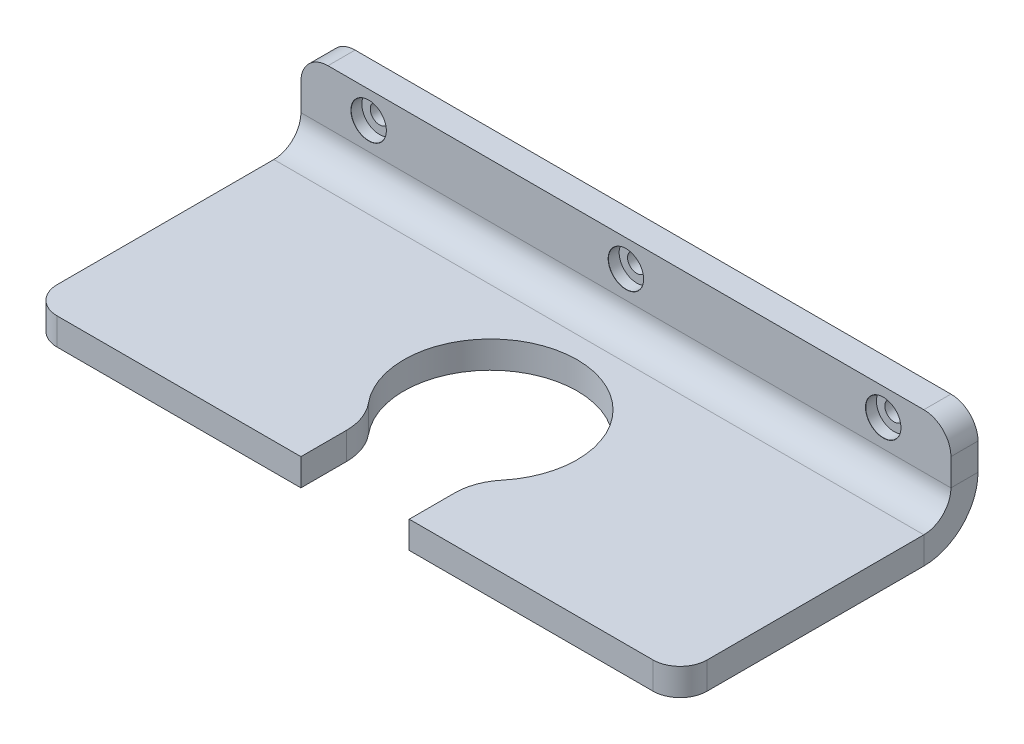
ISO-10303-21;
HEADER;
FILE_DESCRIPTION(('STEP AP214'),'2;1');
FILE_NAME('part.step','',(''),(''),'','','');
FILE_SCHEMA(('AUTOMOTIVE_DESIGN { 1 0 10303 214 1 1 1 1 }'));
ENDSEC;
DATA;
#1=APPLICATION_CONTEXT('core data for automotive mechanical design processes');
#2=APPLICATION_PROTOCOL_DEFINITION('international standard','automotive_design',2000,#1);
#3=PRODUCT_CONTEXT('',#1,'mechanical');
#4=PRODUCT('Part','Part','',(#3));
#5=PRODUCT_RELATED_PRODUCT_CATEGORY('part','',(#4));
#6=PRODUCT_DEFINITION_FORMATION('','',#4);
#7=PRODUCT_DEFINITION_CONTEXT('part definition',#1,'design');
#8=PRODUCT_DEFINITION('design','',#6,#7);
#9=PRODUCT_DEFINITION_SHAPE('','',#8);
#10=(LENGTH_UNIT() NAMED_UNIT(*) SI_UNIT(.MILLI.,.METRE.));
#11=(NAMED_UNIT(*) PLANE_ANGLE_UNIT() SI_UNIT($,.RADIAN.));
#12=(NAMED_UNIT(*) SI_UNIT($,.STERADIAN.) SOLID_ANGLE_UNIT());
#13=UNCERTAINTY_MEASURE_WITH_UNIT(LENGTH_MEASURE(1.E-05),#10,'distance_accuracy_value','');
#14=(GEOMETRIC_REPRESENTATION_CONTEXT(3) GLOBAL_UNCERTAINTY_ASSIGNED_CONTEXT((#13)) GLOBAL_UNIT_ASSIGNED_CONTEXT((#10,
#11,#12)) REPRESENTATION_CONTEXT('',''));
#15=CARTESIAN_POINT('',(0.,0.,0.));
#16=DIRECTION('',(0.,0.,1.));
#17=DIRECTION('',(1.,0.,0.));
#18=AXIS2_PLACEMENT_3D('',#15,#16,#17);
#19=CARTESIAN_POINT('',(-60.,5.,25.));
#20=DIRECTION('',(0.,0.,-1.));
#21=DIRECTION('',(-1.,0.,0.));
#22=AXIS2_PLACEMENT_3D('',#19,#20,#21);
#23=PLANE('',#22);
#24=DIRECTION('',(1.,0.,0.));
#25=VECTOR('',#24,1.);
#26=CARTESIAN_POINT('',(-60.,5.,25.));
#27=LINE('',#26,#25);
#28=CARTESIAN_POINT('',(-55.,5.,25.));
#29=VERTEX_POINT('',#28);
#30=CARTESIAN_POINT('',(-10.,5.,25.));
#31=VERTEX_POINT('',#30);
#32=EDGE_CURVE('E338',#29,#31,#27,.T.);
#33=ORIENTED_EDGE('',*,*,#32,.F.);
#34=DIRECTION('',(0.,-1.,0.));
#35=VECTOR('',#34,1.);
#36=CARTESIAN_POINT('',(-55.,5.,25.));
#37=LINE('',#36,#35);
#38=CARTESIAN_POINT('',(-55.,0.,25.));
#39=VERTEX_POINT('',#38);
#40=EDGE_CURVE('E68',#29,#39,#37,.T.);
#41=ORIENTED_EDGE('',*,*,#40,.T.);
#42=DIRECTION('',(1.,0.,0.));
#43=VECTOR('',#42,1.);
#44=CARTESIAN_POINT('',(-60.,0.,25.));
#45=LINE('',#44,#43);
#46=CARTESIAN_POINT('',(-10.,0.,25.));
#47=VERTEX_POINT('',#46);
#48=EDGE_CURVE('E334',#39,#47,#45,.T.);
#49=ORIENTED_EDGE('',*,*,#48,.T.);
#50=DIRECTION('',(0.,1.,0.));
#51=VECTOR('',#50,1.);
#52=CARTESIAN_POINT('',(-10.,0.,25.));
#53=LINE('',#52,#51);
#54=EDGE_CURVE('E246',#47,#31,#53,.T.);
#55=ORIENTED_EDGE('',*,*,#54,.T.);
#56=EDGE_LOOP('',(#33,#41,#49,#55));
#57=FACE_BOUND('',#56,.T.);
#58=ADVANCED_FACE('F59',(#57),#23,.F.);
#59=CARTESIAN_POINT('',(60.,5.,25.));
#60=DIRECTION('',(-1.,0.,0.));
#61=DIRECTION('',(0.,0.,1.));
#62=AXIS2_PLACEMENT_3D('',#59,#60,#61);
#63=PLANE('',#62);
#64=DIRECTION('',(0.,0.,-1.));
#65=VECTOR('',#64,1.);
#66=CARTESIAN_POINT('',(60.,5.,25.));
#67=LINE('',#66,#65);
#68=CARTESIAN_POINT('',(60.,5.,20.));
#69=VERTEX_POINT('',#68);
#70=CARTESIAN_POINT('',(60.,4.99999999999995,-20.));
#71=VERTEX_POINT('',#70);
#72=EDGE_CURVE('E330',#69,#71,#67,.T.);
#73=ORIENTED_EDGE('',*,*,#72,.F.);
#74=DIRECTION('',(0.,-1.,0.));
#75=VECTOR('',#74,1.);
#76=CARTESIAN_POINT('',(60.,5.,20.));
#77=LINE('',#76,#75);
#78=CARTESIAN_POINT('',(60.,0.,20.));
#79=VERTEX_POINT('',#78);
#80=EDGE_CURVE('E374',#69,#79,#77,.T.);
#81=ORIENTED_EDGE('',*,*,#80,.T.);
#82=DIRECTION('',(0.,0.,-1.));
#83=VECTOR('',#82,1.);
#84=CARTESIAN_POINT('',(60.,0.,25.));
#85=LINE('',#84,#83);
#86=CARTESIAN_POINT('',(60.,0.,-20.));
#87=VERTEX_POINT('',#86);
#88=EDGE_CURVE('E326',#79,#87,#85,.T.);
#89=ORIENTED_EDGE('',*,*,#88,.T.);
#90=DIRECTION('',(0.,-1.,0.));
#91=VECTOR('',#90,1.);
#92=CARTESIAN_POINT('',(60.,4.99999999999995,-20.));
#93=LINE('',#92,#91);
#94=EDGE_CURVE('E322',#71,#87,#93,.T.);
#95=ORIENTED_EDGE('',*,*,#94,.F.);
#96=EDGE_LOOP('',(#73,#81,#89,#95));
#97=FACE_BOUND('',#96,.T.);
#98=ADVANCED_FACE('F426',(#97),#63,.F.);
#99=CARTESIAN_POINT('',(-60.,5.,25.));
#100=DIRECTION('',(1.,0.,0.));
#101=DIRECTION('',(0.,0.,-1.));
#102=AXIS2_PLACEMENT_3D('',#99,#100,#101);
#103=PLANE('',#102);
#104=DIRECTION('',(0.,0.,1.));
#105=VECTOR('',#104,1.);
#106=CARTESIAN_POINT('',(-60.,0.,25.));
#107=LINE('',#106,#105);
#108=CARTESIAN_POINT('',(-60.,0.,-20.));
#109=VERTEX_POINT('',#108);
#110=CARTESIAN_POINT('',(-60.,0.,20.));
#111=VERTEX_POINT('',#110);
#112=EDGE_CURVE('E344',#109,#111,#107,.T.);
#113=ORIENTED_EDGE('',*,*,#112,.T.);
#114=DIRECTION('',(0.,-1.,0.));
#115=VECTOR('',#114,1.);
#116=CARTESIAN_POINT('',(-60.,5.,20.));
#117=LINE('',#116,#115);
#118=CARTESIAN_POINT('',(-60.,5.,20.));
#119=VERTEX_POINT('',#118);
#120=EDGE_CURVE('E13',#111,#119,#117,.F.);
#121=ORIENTED_EDGE('',*,*,#120,.T.);
#122=DIRECTION('',(0.,0.,1.));
#123=VECTOR('',#122,1.);
#124=CARTESIAN_POINT('',(-60.,5.,25.));
#125=LINE('',#124,#123);
#126=CARTESIAN_POINT('',(-60.,4.99999999999995,-20.));
#127=VERTEX_POINT('',#126);
#128=EDGE_CURVE('E333',#127,#119,#125,.T.);
#129=ORIENTED_EDGE('',*,*,#128,.F.);
#130=DIRECTION('',(0.,-1.,0.));
#131=VECTOR('',#130,1.);
#132=CARTESIAN_POINT('',(-60.,4.99999999999995,-20.));
#133=LINE('',#132,#131);
#134=EDGE_CURVE('E307',#127,#109,#133,.T.);
#135=ORIENTED_EDGE('',*,*,#134,.T.);
#136=EDGE_LOOP('',(#113,#121,#129,#135));
#137=FACE_BOUND('',#136,.T.);
#138=ADVANCED_FACE('F439',(#137),#103,.F.);
#139=CARTESIAN_POINT('',(0.,5.,0.));
#140=DIRECTION('',(0.,-1.,0.));
#141=DIRECTION('',(0.,0.,-1.));
#142=AXIS2_PLACEMENT_3D('',#139,#140,#141);
#143=PLANE('',#142);
#144=CARTESIAN_POINT('',(10.,5.,25.));
#145=VERTEX_POINT('',#144);
#146=CARTESIAN_POINT('',(55.,5.,25.));
#147=VERTEX_POINT('',#146);
#148=EDGE_CURVE('E337',#145,#147,#27,.T.);
#149=ORIENTED_EDGE('',*,*,#148,.T.);
#150=CARTESIAN_POINT('',(55.,5.,20.));
#151=DIRECTION('',(0.,-1.,0.));
#152=DIRECTION('',(0.,0.,-1.));
#153=AXIS2_PLACEMENT_3D('',#150,#151,#152);
#154=CIRCLE('',#153,5.);
#155=EDGE_CURVE('E389',#147,#69,#154,.F.);
#156=ORIENTED_EDGE('',*,*,#155,.T.);
#157=ORIENTED_EDGE('',*,*,#72,.T.);
#158=DIRECTION('',(-1.,0.,0.));
#159=VECTOR('',#158,1.);
#160=CARTESIAN_POINT('',(-60.,4.99999999999995,-20.));
#161=LINE('',#160,#159);
#162=EDGE_CURVE('E315',#127,#71,#161,.F.);
#163=ORIENTED_EDGE('',*,*,#162,.F.);
#164=ORIENTED_EDGE('',*,*,#128,.T.);
#165=CARTESIAN_POINT('',(-55.,5.,20.));
#166=DIRECTION('',(0.,-1.,0.));
#167=DIRECTION('',(0.,0.,-1.));
#168=AXIS2_PLACEMENT_3D('',#165,#166,#167);
#169=CIRCLE('',#168,5.);
#170=EDGE_CURVE('E80',#119,#29,#169,.F.);
#171=ORIENTED_EDGE('',*,*,#170,.T.);
#172=ORIENTED_EDGE('',*,*,#32,.T.);
#173=DIRECTION('',(0.,0.,1.));
#174=VECTOR('',#173,1.);
#175=CARTESIAN_POINT('',(-10.,5.,25.));
#176=LINE('',#175,#174);
#177=CARTESIAN_POINT('',(-9.99999999999999,5.,16.6132477258362));
#178=VERTEX_POINT('',#177);
#179=EDGE_CURVE('E214',#178,#31,#176,.T.);
#180=ORIENTED_EDGE('',*,*,#179,.F.);
#181=CARTESIAN_POINT('',(-20.,5.,16.6132477258362));
#182=DIRECTION('',(0.,-1.,0.));
#183=DIRECTION('',(0.,0.,1.));
#184=AXIS2_PLACEMENT_3D('',#181,#182,#183);
#185=CIRCLE('',#184,10.);
#186=CARTESIAN_POINT('',(-12.3076923076923,5.,10.223537062053));
#187=VERTEX_POINT('',#186);
#188=EDGE_CURVE('E218',#187,#178,#185,.T.);
#189=ORIENTED_EDGE('',*,*,#188,.F.);
#190=CARTESIAN_POINT('',(0.,5.,0.));
#191=DIRECTION('',(0.,1.,0.));
#192=DIRECTION('',(0.,0.,-1.));
#193=AXIS2_PLACEMENT_3D('',#190,#191,#192);
#194=CIRCLE('',#193,16.);
#195=CARTESIAN_POINT('',(12.3076923076923,5.,10.223537062053));
#196=VERTEX_POINT('',#195);
#197=EDGE_CURVE('E239',#196,#187,#194,.T.);
#198=ORIENTED_EDGE('',*,*,#197,.F.);
#199=CARTESIAN_POINT('',(20.,5.,16.6132477258362));
#200=DIRECTION('',(0.,-1.,0.));
#201=DIRECTION('',(0.,0.,1.));
#202=AXIS2_PLACEMENT_3D('',#199,#200,#201);
#203=CIRCLE('',#202,10.);
#204=CARTESIAN_POINT('',(9.99999999999999,5.,16.6132477258362));
#205=VERTEX_POINT('',#204);
#206=EDGE_CURVE('E236',#205,#196,#203,.T.);
#207=ORIENTED_EDGE('',*,*,#206,.F.);
#208=DIRECTION('',(0.,0.,-1.));
#209=VECTOR('',#208,1.);
#210=CARTESIAN_POINT('',(9.99999999999999,5.,16.6132477258362));
#211=LINE('',#210,#209);
#212=EDGE_CURVE('E191',#145,#205,#211,.T.);
#213=ORIENTED_EDGE('',*,*,#212,.F.);
#214=EDGE_LOOP('',(#149,#156,#157,#163,#164,#171,#172,#180,#189,#198,#207,#213));
#215=FACE_BOUND('',#214,.T.);
#216=ADVANCED_FACE('F406',(#215),#143,.F.);
#217=CARTESIAN_POINT('',(0.,0.,0.));
#218=DIRECTION('',(0.,-1.,0.));
#219=DIRECTION('',(0.,0.,-1.));
#220=AXIS2_PLACEMENT_3D('',#217,#218,#219);
#221=PLANE('',#220);
#222=ORIENTED_EDGE('',*,*,#88,.F.);
#223=CARTESIAN_POINT('',(55.,0.,20.));
#224=DIRECTION('',(0.,-1.,0.));
#225=DIRECTION('',(0.,0.,-1.));
#226=AXIS2_PLACEMENT_3D('',#223,#224,#225);
#227=CIRCLE('',#226,5.);
#228=CARTESIAN_POINT('',(55.,0.,25.));
#229=VERTEX_POINT('',#228);
#230=EDGE_CURVE('E381',#79,#229,#227,.T.);
#231=ORIENTED_EDGE('',*,*,#230,.T.);
#232=CARTESIAN_POINT('',(9.99999999999999,0.,25.));
#233=VERTEX_POINT('',#232);
#234=EDGE_CURVE('E212',#233,#229,#45,.T.);
#235=ORIENTED_EDGE('',*,*,#234,.F.);
#236=DIRECTION('',(0.,0.,-1.));
#237=VECTOR('',#236,1.);
#238=CARTESIAN_POINT('',(9.99999999999999,0.,16.6132477258362));
#239=LINE('',#238,#237);
#240=CARTESIAN_POINT('',(9.99999999999999,0.,16.6132477258362));
#241=VERTEX_POINT('',#240);
#242=EDGE_CURVE('E188',#233,#241,#239,.T.);
#243=ORIENTED_EDGE('',*,*,#242,.T.);
#244=CARTESIAN_POINT('',(20.,0.,16.6132477258362));
#245=DIRECTION('',(0.,-1.,0.));
#246=DIRECTION('',(0.,0.,1.));
#247=AXIS2_PLACEMENT_3D('',#244,#245,#246);
#248=CIRCLE('',#247,10.);
#249=CARTESIAN_POINT('',(12.3076923076923,0.,10.223537062053));
#250=VERTEX_POINT('',#249);
#251=EDGE_CURVE('E200',#241,#250,#248,.T.);
#252=ORIENTED_EDGE('',*,*,#251,.T.);
#253=CARTESIAN_POINT('',(0.,0.,0.));
#254=DIRECTION('',(0.,1.,0.));
#255=DIRECTION('',(0.,0.,-1.));
#256=AXIS2_PLACEMENT_3D('',#253,#254,#255);
#257=CIRCLE('',#256,16.);
#258=CARTESIAN_POINT('',(-12.3076923076923,0.,10.223537062053));
#259=VERTEX_POINT('',#258);
#260=EDGE_CURVE('E206',#250,#259,#257,.T.);
#261=ORIENTED_EDGE('',*,*,#260,.T.);
#262=CARTESIAN_POINT('',(-20.,0.,16.6132477258362));
#263=DIRECTION('',(0.,-1.,0.));
#264=DIRECTION('',(0.,0.,1.));
#265=AXIS2_PLACEMENT_3D('',#262,#263,#264);
#266=CIRCLE('',#265,10.);
#267=CARTESIAN_POINT('',(-9.99999999999999,0.,16.6132477258362));
#268=VERTEX_POINT('',#267);
#269=EDGE_CURVE('E226',#259,#268,#266,.T.);
#270=ORIENTED_EDGE('',*,*,#269,.T.);
#271=DIRECTION('',(0.,0.,1.));
#272=VECTOR('',#271,1.);
#273=CARTESIAN_POINT('',(-10.,0.,25.));
#274=LINE('',#273,#272);
#275=EDGE_CURVE('E230',#268,#47,#274,.T.);
#276=ORIENTED_EDGE('',*,*,#275,.T.);
#277=ORIENTED_EDGE('',*,*,#48,.F.);
#278=CARTESIAN_POINT('',(-55.,0.,20.));
#279=DIRECTION('',(0.,-1.,0.));
#280=DIRECTION('',(0.,0.,-1.));
#281=AXIS2_PLACEMENT_3D('',#278,#279,#280);
#282=CIRCLE('',#281,5.);
#283=EDGE_CURVE('E378',#39,#111,#282,.T.);
#284=ORIENTED_EDGE('',*,*,#283,.T.);
#285=ORIENTED_EDGE('',*,*,#112,.F.);
#286=DIRECTION('',(-1.,0.,0.));
#287=VECTOR('',#286,1.);
#288=CARTESIAN_POINT('',(-60.,0.,-20.));
#289=LINE('',#288,#287);
#290=EDGE_CURVE('E298',#109,#87,#289,.F.);
#291=ORIENTED_EDGE('',*,*,#290,.T.);
#292=EDGE_LOOP('',(#222,#231,#235,#243,#252,#261,#270,#276,#277,#284,#285,#291));
#293=FACE_BOUND('',#292,.T.);
#294=ADVANCED_FACE('F210',(#293),#221,.T.);
#295=ORIENTED_EDGE('',*,*,#234,.T.);
#296=DIRECTION('',(0.,-1.,0.));
#297=VECTOR('',#296,1.);
#298=CARTESIAN_POINT('',(55.,5.,25.));
#299=LINE('',#298,#297);
#300=EDGE_CURVE('E384',#229,#147,#299,.F.);
#301=ORIENTED_EDGE('',*,*,#300,.T.);
#302=ORIENTED_EDGE('',*,*,#148,.F.);
#303=DIRECTION('',(0.,1.,0.));
#304=VECTOR('',#303,1.);
#305=CARTESIAN_POINT('',(10.,0.,25.));
#306=LINE('',#305,#304);
#307=EDGE_CURVE('E197',#233,#145,#306,.T.);
#308=ORIENTED_EDGE('',*,*,#307,.F.);
#309=EDGE_LOOP('',(#295,#301,#302,#308));
#310=FACE_BOUND('',#309,.T.);
#311=ADVANCED_FACE('F415',(#310),#23,.F.);
#312=CARTESIAN_POINT('',(60.,9.99999999999995,-20.));
#313=DIRECTION('',(1.,0.,0.));
#314=DIRECTION('',(0.,0.,-1.));
#315=AXIS2_PLACEMENT_3D('',#312,#313,#314);
#316=PLANE('',#315);
#317=DIRECTION('',(0.,0.,-1.));
#318=VECTOR('',#317,1.);
#319=CARTESIAN_POINT('',(60.,9.99999999999998,-25.));
#320=LINE('',#319,#318);
#321=CARTESIAN_POINT('',(60.,9.99999999999993,-25.));
#322=VERTEX_POINT('',#321);
#323=CARTESIAN_POINT('',(60.,9.99999999999992,-30.));
#324=VERTEX_POINT('',#323);
#325=EDGE_CURVE('E250',#322,#324,#320,.T.);
#326=ORIENTED_EDGE('',*,*,#325,.F.);
#327=CARTESIAN_POINT('',(60.,9.99999999999995,-20.));
#328=DIRECTION('',(-1.,0.,0.));
#329=DIRECTION('',(0.,0.,1.));
#330=AXIS2_PLACEMENT_3D('',#327,#328,#329);
#331=CIRCLE('',#330,5.);
#332=EDGE_CURVE('E311',#71,#322,#331,.F.);
#333=ORIENTED_EDGE('',*,*,#332,.F.);
#334=ORIENTED_EDGE('',*,*,#94,.T.);
#335=CARTESIAN_POINT('',(60.,9.99999999999995,-20.));
#336=DIRECTION('',(-1.,0.,0.));
#337=DIRECTION('',(0.,0.,1.));
#338=AXIS2_PLACEMENT_3D('',#335,#336,#337);
#339=CIRCLE('',#338,10.);
#340=EDGE_CURVE('E302',#87,#324,#339,.F.);
#341=ORIENTED_EDGE('',*,*,#340,.T.);
#342=EDGE_LOOP('',(#326,#333,#334,#341));
#343=FACE_BOUND('',#342,.T.);
#344=ADVANCED_FACE('F431',(#343),#316,.T.);
#345=CARTESIAN_POINT('',(-60.,9.99999999999995,-20.));
#346=DIRECTION('',(1.,0.,0.));
#347=DIRECTION('',(0.,0.,-1.));
#348=AXIS2_PLACEMENT_3D('',#345,#346,#347);
#349=PLANE('',#348);
#350=CARTESIAN_POINT('',(-60.,9.99999999999995,-20.));
#351=DIRECTION('',(-1.,0.,0.));
#352=DIRECTION('',(0.,0.,1.));
#353=AXIS2_PLACEMENT_3D('',#350,#351,#352);
#354=CIRCLE('',#353,5.);
#355=CARTESIAN_POINT('',(-60.,9.99999999999993,-25.));
#356=VERTEX_POINT('',#355);
#357=EDGE_CURVE('E288',#356,#127,#354,.T.);
#358=ORIENTED_EDGE('',*,*,#357,.F.);
#359=DIRECTION('',(0.,0.,-1.));
#360=VECTOR('',#359,1.);
#361=CARTESIAN_POINT('',(-60.,9.99999999999999,-25.));
#362=LINE('',#361,#360);
#363=CARTESIAN_POINT('',(-60.,10.,-30.));
#364=VERTEX_POINT('',#363);
#365=EDGE_CURVE('E264',#356,#364,#362,.T.);
#366=ORIENTED_EDGE('',*,*,#365,.T.);
#367=CARTESIAN_POINT('',(-60.,9.99999999999995,-20.));
#368=DIRECTION('',(-1.,0.,0.));
#369=DIRECTION('',(0.,0.,1.));
#370=AXIS2_PLACEMENT_3D('',#367,#368,#369);
#371=CIRCLE('',#370,10.);
#372=EDGE_CURVE('E303',#364,#109,#371,.T.);
#373=ORIENTED_EDGE('',*,*,#372,.T.);
#374=ORIENTED_EDGE('',*,*,#134,.F.);
#375=EDGE_LOOP('',(#358,#366,#373,#374));
#376=FACE_BOUND('',#375,.T.);
#377=ADVANCED_FACE('F436',(#376),#349,.F.);
#378=CARTESIAN_POINT('',(-60.,9.99999999999995,-20.));
#379=DIRECTION('',(-1.,0.,0.));
#380=DIRECTION('',(0.,0.,-1.));
#381=AXIS2_PLACEMENT_3D('',#378,#379,#380);
#382=CYLINDRICAL_SURFACE('',#381,10.);
#383=ORIENTED_EDGE('',*,*,#290,.F.);
#384=ORIENTED_EDGE('',*,*,#372,.F.);
#385=DIRECTION('',(1.,0.,0.));
#386=VECTOR('',#385,1.);
#387=CARTESIAN_POINT('',(0.,10.,-30.));
#388=LINE('',#387,#386);
#389=EDGE_CURVE('E268',#364,#324,#388,.T.);
#390=ORIENTED_EDGE('',*,*,#389,.T.);
#391=ORIENTED_EDGE('',*,*,#340,.F.);
#392=EDGE_LOOP('',(#383,#384,#390,#391));
#393=FACE_BOUND('',#392,.T.);
#394=ADVANCED_FACE('F433',(#393),#382,.T.);
#395=CARTESIAN_POINT('',(-60.,9.99999999999995,-20.));
#396=DIRECTION('',(-1.,0.,0.));
#397=DIRECTION('',(0.,0.,-1.));
#398=AXIS2_PLACEMENT_3D('',#395,#396,#397);
#399=CYLINDRICAL_SURFACE('',#398,5.);
#400=ORIENTED_EDGE('',*,*,#162,.T.);
#401=ORIENTED_EDGE('',*,*,#332,.T.);
#402=DIRECTION('',(-1.,0.,0.));
#403=VECTOR('',#402,1.);
#404=CARTESIAN_POINT('',(60.,9.99999999999998,-25.));
#405=LINE('',#404,#403);
#406=EDGE_CURVE('E261',#322,#356,#405,.T.);
#407=ORIENTED_EDGE('',*,*,#406,.T.);
#408=ORIENTED_EDGE('',*,*,#357,.T.);
#409=EDGE_LOOP('',(#400,#401,#407,#408));
#410=FACE_BOUND('',#409,.T.);
#411=ADVANCED_FACE('F468',(#410),#399,.F.);
#412=CARTESIAN_POINT('',(60.,4.99999999999998,-30.));
#413=DIRECTION('',(-1.,0.,0.));
#414=DIRECTION('',(0.,0.,1.));
#415=AXIS2_PLACEMENT_3D('',#412,#413,#414);
#416=PLANE('',#415);
#417=DIRECTION('',(0.,-1.,0.));
#418=VECTOR('',#417,1.);
#419=CARTESIAN_POINT('',(60.,4.99999999999998,-30.));
#420=LINE('',#419,#418);
#421=CARTESIAN_POINT('',(60.,15.,-30.));
#422=VERTEX_POINT('',#421);
#423=EDGE_CURVE('E276',#422,#324,#420,.T.);
#424=ORIENTED_EDGE('',*,*,#423,.F.);
#425=DIRECTION('',(0.,0.,1.));
#426=VECTOR('',#425,1.);
#427=CARTESIAN_POINT('',(60.,15.,-30.));
#428=LINE('',#427,#426);
#429=CARTESIAN_POINT('',(60.,15.,-25.));
#430=VERTEX_POINT('',#429);
#431=EDGE_CURVE('E370',#422,#430,#428,.T.);
#432=ORIENTED_EDGE('',*,*,#431,.T.);
#433=DIRECTION('',(0.,-1.,0.));
#434=VECTOR('',#433,1.);
#435=CARTESIAN_POINT('',(60.,5.,-25.));
#436=LINE('',#435,#434);
#437=EDGE_CURVE('E275',#430,#322,#436,.T.);
#438=ORIENTED_EDGE('',*,*,#437,.T.);
#439=ORIENTED_EDGE('',*,*,#325,.T.);
#440=EDGE_LOOP('',(#424,#432,#438,#439));
#441=FACE_BOUND('',#440,.T.);
#442=ADVANCED_FACE('F471',(#441),#416,.F.);
#443=CARTESIAN_POINT('',(-60.,20.,-30.0000000000001));
#444=DIRECTION('',(1.,0.,0.));
#445=DIRECTION('',(0.,0.,-1.));
#446=AXIS2_PLACEMENT_3D('',#443,#444,#445);
#447=PLANE('',#446);
#448=DIRECTION('',(0.,1.,0.));
#449=VECTOR('',#448,1.);
#450=CARTESIAN_POINT('',(-60.,20.,-25.0000000000001));
#451=LINE('',#450,#449);
#452=CARTESIAN_POINT('',(-60.,15.,-25.));
#453=VERTEX_POINT('',#452);
#454=EDGE_CURVE('E291',#356,#453,#451,.T.);
#455=ORIENTED_EDGE('',*,*,#454,.T.);
#456=DIRECTION('',(0.,0.,1.));
#457=VECTOR('',#456,1.);
#458=CARTESIAN_POINT('',(-60.,15.,-30.));
#459=LINE('',#458,#457);
#460=CARTESIAN_POINT('',(-60.,15.,-30.));
#461=VERTEX_POINT('',#460);
#462=EDGE_CURVE('E361',#453,#461,#459,.F.);
#463=ORIENTED_EDGE('',*,*,#462,.T.);
#464=DIRECTION('',(0.,1.,0.));
#465=VECTOR('',#464,1.);
#466=CARTESIAN_POINT('',(-60.,20.,-30.0000000000001));
#467=LINE('',#466,#465);
#468=EDGE_CURVE('E279',#364,#461,#467,.T.);
#469=ORIENTED_EDGE('',*,*,#468,.F.);
#470=ORIENTED_EDGE('',*,*,#365,.F.);
#471=EDGE_LOOP('',(#455,#463,#469,#470));
#472=FACE_BOUND('',#471,.T.);
#473=ADVANCED_FACE('F476',(#472),#447,.F.);
#474=CARTESIAN_POINT('',(0.,-1.04193580493056E-13,-30.));
#475=DIRECTION('',(0.,0.,1.));
#476=DIRECTION('',(0.,-1.,0.));
#477=AXIS2_PLACEMENT_3D('',#474,#475,#476);
#478=PLANE('',#477);
#479=CARTESIAN_POINT('',(-47.5,15.,-30.));
#480=DIRECTION('',(0.,0.,1.));
#481=DIRECTION('',(0.,-1.,0.));
#482=AXIS2_PLACEMENT_3D('',#479,#480,#481);
#483=CIRCLE('',#482,1.7);
#484=CARTESIAN_POINT('',(-47.5,13.3,-30.));
#485=VERTEX_POINT('',#484);
#486=EDGE_CURVE('E575',#485,#485,#483,.T.);
#487=ORIENTED_EDGE('',*,*,#486,.T.);
#488=EDGE_LOOP('',(#487));
#489=FACE_BOUND('',#488,.T.);
#490=CARTESIAN_POINT('',(0.,15.,-30.));
#491=DIRECTION('',(0.,0.,1.));
#492=DIRECTION('',(0.,-1.,0.));
#493=AXIS2_PLACEMENT_3D('',#490,#491,#492);
#494=CIRCLE('',#493,1.7);
#495=CARTESIAN_POINT('',(0.,13.3,-30.));
#496=VERTEX_POINT('',#495);
#497=EDGE_CURVE('E595',#496,#496,#494,.T.);
#498=ORIENTED_EDGE('',*,*,#497,.T.);
#499=EDGE_LOOP('',(#498));
#500=FACE_BOUND('',#499,.T.);
#501=CARTESIAN_POINT('',(47.5,15.,-30.));
#502=DIRECTION('',(0.,0.,1.));
#503=DIRECTION('',(0.,-1.,0.));
#504=AXIS2_PLACEMENT_3D('',#501,#502,#503);
#505=CIRCLE('',#504,1.7);
#506=CARTESIAN_POINT('',(47.5,13.3,-30.));
#507=VERTEX_POINT('',#506);
#508=EDGE_CURVE('E221',#507,#507,#505,.T.);
#509=ORIENTED_EDGE('',*,*,#508,.T.);
#510=EDGE_LOOP('',(#509));
#511=FACE_BOUND('',#510,.T.);
#512=ORIENTED_EDGE('',*,*,#468,.T.);
#513=CARTESIAN_POINT('',(-55.,15.,-30.));
#514=DIRECTION('',(0.,0.,1.));
#515=DIRECTION('',(0.,-1.,0.));
#516=AXIS2_PLACEMENT_3D('',#513,#514,#515);
#517=CIRCLE('',#516,5.);
#518=CARTESIAN_POINT('',(-55.,20.,-30.0000000000001));
#519=VERTEX_POINT('',#518);
#520=EDGE_CURVE('E367',#461,#519,#517,.F.);
#521=ORIENTED_EDGE('',*,*,#520,.T.);
#522=DIRECTION('',(1.,0.,0.));
#523=VECTOR('',#522,1.);
#524=CARTESIAN_POINT('',(60.,20.,-30.0000000000001));
#525=LINE('',#524,#523);
#526=CARTESIAN_POINT('',(55.,20.,-30.0000000000001));
#527=VERTEX_POINT('',#526);
#528=EDGE_CURVE('E284',#519,#527,#525,.T.);
#529=ORIENTED_EDGE('',*,*,#528,.T.);
#530=CARTESIAN_POINT('',(55.,15.,-30.));
#531=DIRECTION('',(0.,0.,1.));
#532=DIRECTION('',(0.,-1.,0.));
#533=AXIS2_PLACEMENT_3D('',#530,#531,#532);
#534=CIRCLE('',#533,5.);
#535=EDGE_CURVE('E364',#527,#422,#534,.F.);
#536=ORIENTED_EDGE('',*,*,#535,.T.);
#537=ORIENTED_EDGE('',*,*,#423,.T.);
#538=ORIENTED_EDGE('',*,*,#389,.F.);
#539=EDGE_LOOP('',(#512,#521,#529,#536,#537,#538));
#540=FACE_BOUND('',#539,.T.);
#541=ADVANCED_FACE('F480',(#489,#500,#511,#540),#478,.F.);
#542=CARTESIAN_POINT('',(0.,0.,-25.));
#543=DIRECTION('',(0.,0.,1.));
#544=DIRECTION('',(0.,-1.,0.));
#545=AXIS2_PLACEMENT_3D('',#542,#543,#544);
#546=PLANE('',#545);
#547=CARTESIAN_POINT('',(-47.5,15.,-25.));
#548=DIRECTION('',(0.,0.,1.));
#549=DIRECTION('',(1.,0.,0.));
#550=AXIS2_PLACEMENT_3D('',#547,#548,#549);
#551=CIRCLE('',#550,3.275);
#552=CARTESIAN_POINT('',(-44.225,15.,-25.));
#553=VERTEX_POINT('',#552);
#554=EDGE_CURVE('E561',#553,#553,#551,.T.);
#555=ORIENTED_EDGE('',*,*,#554,.F.);
#556=EDGE_LOOP('',(#555));
#557=FACE_BOUND('',#556,.T.);
#558=CARTESIAN_POINT('',(0.,15.,-25.));
#559=DIRECTION('',(0.,0.,1.));
#560=DIRECTION('',(1.,0.,0.));
#561=AXIS2_PLACEMENT_3D('',#558,#559,#560);
#562=CIRCLE('',#561,3.275);
#563=CARTESIAN_POINT('',(3.275,15.,-25.));
#564=VERTEX_POINT('',#563);
#565=EDGE_CURVE('E579',#564,#564,#562,.T.);
#566=ORIENTED_EDGE('',*,*,#565,.F.);
#567=EDGE_LOOP('',(#566));
#568=FACE_BOUND('',#567,.T.);
#569=CARTESIAN_POINT('',(47.5,15.,-25.));
#570=DIRECTION('',(0.,0.,1.));
#571=DIRECTION('',(1.,0.,0.));
#572=AXIS2_PLACEMENT_3D('',#569,#570,#571);
#573=CIRCLE('',#572,3.275);
#574=CARTESIAN_POINT('',(50.775,15.,-25.));
#575=VERTEX_POINT('',#574);
#576=EDGE_CURVE('E599',#575,#575,#573,.T.);
#577=ORIENTED_EDGE('',*,*,#576,.F.);
#578=EDGE_LOOP('',(#577));
#579=FACE_BOUND('',#578,.T.);
#580=DIRECTION('',(1.,0.,0.));
#581=VECTOR('',#580,1.);
#582=CARTESIAN_POINT('',(60.,20.,-25.0000000000001));
#583=LINE('',#582,#581);
#584=CARTESIAN_POINT('',(-55.,20.,-25.0000000000001));
#585=VERTEX_POINT('',#584);
#586=CARTESIAN_POINT('',(55.,20.,-25.0000000000001));
#587=VERTEX_POINT('',#586);
#588=EDGE_CURVE('E280',#585,#587,#583,.T.);
#589=ORIENTED_EDGE('',*,*,#588,.F.);
#590=CARTESIAN_POINT('',(-55.,15.,-25.));
#591=DIRECTION('',(0.,0.,1.));
#592=DIRECTION('',(0.,-1.,0.));
#593=AXIS2_PLACEMENT_3D('',#590,#591,#592);
#594=CIRCLE('',#593,5.);
#595=EDGE_CURVE('E358',#585,#453,#594,.T.);
#596=ORIENTED_EDGE('',*,*,#595,.T.);
#597=ORIENTED_EDGE('',*,*,#454,.F.);
#598=ORIENTED_EDGE('',*,*,#406,.F.);
#599=ORIENTED_EDGE('',*,*,#437,.F.);
#600=CARTESIAN_POINT('',(55.,15.,-25.));
#601=DIRECTION('',(0.,0.,1.));
#602=DIRECTION('',(0.,-1.,0.));
#603=AXIS2_PLACEMENT_3D('',#600,#601,#602);
#604=CIRCLE('',#603,5.);
#605=EDGE_CURVE('E355',#430,#587,#604,.T.);
#606=ORIENTED_EDGE('',*,*,#605,.T.);
#607=EDGE_LOOP('',(#589,#596,#597,#598,#599,#606));
#608=FACE_BOUND('',#607,.T.);
#609=ADVANCED_FACE('F485',(#557,#568,#579,#608),#546,.T.);
#610=CARTESIAN_POINT('',(60.,20.,-30.0000000000001));
#611=DIRECTION('',(0.,-1.,0.));
#612=DIRECTION('',(0.,0.,-1.));
#613=AXIS2_PLACEMENT_3D('',#610,#611,#612);
#614=PLANE('',#613);
#615=ORIENTED_EDGE('',*,*,#528,.F.);
#616=DIRECTION('',(0.,0.,1.));
#617=VECTOR('',#616,1.);
#618=CARTESIAN_POINT('',(-55.,20.,-30.0000000000001));
#619=LINE('',#618,#617);
#620=EDGE_CURVE('E351',#519,#585,#619,.T.);
#621=ORIENTED_EDGE('',*,*,#620,.T.);
#622=ORIENTED_EDGE('',*,*,#588,.T.);
#623=DIRECTION('',(0.,0.,1.));
#624=VECTOR('',#623,1.);
#625=CARTESIAN_POINT('',(55.,20.,-30.0000000000001));
#626=LINE('',#625,#624);
#627=EDGE_CURVE('E341',#587,#527,#626,.F.);
#628=ORIENTED_EDGE('',*,*,#627,.T.);
#629=EDGE_LOOP('',(#615,#621,#622,#628));
#630=FACE_BOUND('',#629,.T.);
#631=ADVANCED_FACE('F482',(#630),#614,.F.);
#632=CARTESIAN_POINT('',(-10.,0.,25.));
#633=DIRECTION('',(-1.,0.,0.));
#634=DIRECTION('',(0.,0.,1.));
#635=AXIS2_PLACEMENT_3D('',#632,#633,#634);
#636=PLANE('',#635);
#637=ORIENTED_EDGE('',*,*,#179,.T.);
#638=ORIENTED_EDGE('',*,*,#54,.F.);
#639=ORIENTED_EDGE('',*,*,#275,.F.);
#640=DIRECTION('',(0.,1.,0.));
#641=VECTOR('',#640,1.);
#642=CARTESIAN_POINT('',(-9.99999999999999,0.,16.6132477258362));
#643=LINE('',#642,#641);
#644=EDGE_CURVE('E251',#268,#178,#643,.T.);
#645=ORIENTED_EDGE('',*,*,#644,.T.);
#646=EDGE_LOOP('',(#637,#638,#639,#645));
#647=FACE_BOUND('',#646,.T.);
#648=ADVANCED_FACE('F402',(#647),#636,.F.);
#649=CARTESIAN_POINT('',(-20.,0.,16.6132477258362));
#650=DIRECTION('',(0.,1.,0.));
#651=DIRECTION('',(0.,0.,1.));
#652=AXIS2_PLACEMENT_3D('',#649,#650,#651);
#653=CYLINDRICAL_SURFACE('',#652,10.);
#654=ORIENTED_EDGE('',*,*,#188,.T.);
#655=ORIENTED_EDGE('',*,*,#644,.F.);
#656=ORIENTED_EDGE('',*,*,#269,.F.);
#657=DIRECTION('',(0.,1.,0.));
#658=VECTOR('',#657,1.);
#659=CARTESIAN_POINT('',(-12.3076923076923,0.,10.223537062053));
#660=LINE('',#659,#658);
#661=EDGE_CURVE('E254',#259,#187,#660,.T.);
#662=ORIENTED_EDGE('',*,*,#661,.T.);
#663=EDGE_LOOP('',(#654,#655,#656,#662));
#664=FACE_BOUND('',#663,.T.);
#665=ADVANCED_FACE('F409',(#664),#653,.T.);
#666=CARTESIAN_POINT('',(0.,0.,0.));
#667=DIRECTION('',(0.,1.,0.));
#668=DIRECTION('',(0.,0.,1.));
#669=AXIS2_PLACEMENT_3D('',#666,#667,#668);
#670=CYLINDRICAL_SURFACE('',#669,16.);
#671=ORIENTED_EDGE('',*,*,#197,.T.);
#672=ORIENTED_EDGE('',*,*,#661,.F.);
#673=ORIENTED_EDGE('',*,*,#260,.F.);
#674=DIRECTION('',(0.,1.,0.));
#675=VECTOR('',#674,1.);
#676=CARTESIAN_POINT('',(12.3076923076923,0.,10.223537062053));
#677=LINE('',#676,#675);
#678=EDGE_CURVE('E196',#250,#196,#677,.T.);
#679=ORIENTED_EDGE('',*,*,#678,.T.);
#680=EDGE_LOOP('',(#671,#672,#673,#679));
#681=FACE_BOUND('',#680,.T.);
#682=ADVANCED_FACE('F411',(#681),#670,.F.);
#683=CARTESIAN_POINT('',(20.,0.,16.6132477258362));
#684=DIRECTION('',(0.,1.,0.));
#685=DIRECTION('',(0.,0.,1.));
#686=AXIS2_PLACEMENT_3D('',#683,#684,#685);
#687=CYLINDRICAL_SURFACE('',#686,10.);
#688=ORIENTED_EDGE('',*,*,#206,.T.);
#689=ORIENTED_EDGE('',*,*,#678,.F.);
#690=ORIENTED_EDGE('',*,*,#251,.F.);
#691=DIRECTION('',(0.,1.,0.));
#692=VECTOR('',#691,1.);
#693=CARTESIAN_POINT('',(9.99999999999999,0.,16.6132477258362));
#694=LINE('',#693,#692);
#695=EDGE_CURVE('E184',#241,#205,#694,.T.);
#696=ORIENTED_EDGE('',*,*,#695,.T.);
#697=EDGE_LOOP('',(#688,#689,#690,#696));
#698=FACE_BOUND('',#697,.T.);
#699=ADVANCED_FACE('F201',(#698),#687,.T.);
#700=CARTESIAN_POINT('',(9.99999999999999,0.,16.6132477258362));
#701=DIRECTION('',(1.,0.,0.));
#702=DIRECTION('',(0.,0.,-1.));
#703=AXIS2_PLACEMENT_3D('',#700,#701,#702);
#704=PLANE('',#703);
#705=ORIENTED_EDGE('',*,*,#212,.T.);
#706=ORIENTED_EDGE('',*,*,#695,.F.);
#707=ORIENTED_EDGE('',*,*,#242,.F.);
#708=ORIENTED_EDGE('',*,*,#307,.T.);
#709=EDGE_LOOP('',(#705,#706,#707,#708));
#710=FACE_BOUND('',#709,.T.);
#711=ADVANCED_FACE('F186',(#710),#704,.F.);
#712=CARTESIAN_POINT('',(47.5,15.,-25.));
#713=DIRECTION('',(0.,0.,1.));
#714=DIRECTION('',(1.,0.,0.));
#715=AXIS2_PLACEMENT_3D('',#712,#713,#714);
#716=CYLINDRICAL_SURFACE('',#715,1.7);
#717=ORIENTED_EDGE('',*,*,#508,.F.);
#718=EDGE_LOOP('',(#717));
#719=FACE_BOUND('',#718,.T.);
#720=CARTESIAN_POINT('',(47.5,15.,-27.));
#721=DIRECTION('',(0.,0.,1.));
#722=DIRECTION('',(1.,0.,0.));
#723=AXIS2_PLACEMENT_3D('',#720,#721,#722);
#724=CIRCLE('',#723,1.7);
#725=CARTESIAN_POINT('',(49.2,15.,-27.));
#726=VERTEX_POINT('',#725);
#727=EDGE_CURVE('E610',#726,#726,#724,.T.);
#728=ORIENTED_EDGE('',*,*,#727,.T.);
#729=EDGE_LOOP('',(#728));
#730=FACE_BOUND('',#729,.T.);
#731=ADVANCED_FACE('F495',(#719,#730),#716,.F.);
#732=CARTESIAN_POINT('',(50.75,15.,-27.));
#733=DIRECTION('',(0.,0.,-1.));
#734=DIRECTION('',(-1.,0.,0.));
#735=AXIS2_PLACEMENT_3D('',#732,#733,#734);
#736=PLANE('',#735);
#737=ORIENTED_EDGE('',*,*,#727,.F.);
#738=EDGE_LOOP('',(#737));
#739=FACE_BOUND('',#738,.T.);
#740=CARTESIAN_POINT('',(47.5,15.,-27.));
#741=DIRECTION('',(0.,0.,1.));
#742=DIRECTION('',(1.,0.,0.));
#743=AXIS2_PLACEMENT_3D('',#740,#741,#742);
#744=CIRCLE('',#743,3.25);
#745=CARTESIAN_POINT('',(50.75,15.,-27.));
#746=VERTEX_POINT('',#745);
#747=EDGE_CURVE('E607',#746,#746,#744,.T.);
#748=ORIENTED_EDGE('',*,*,#747,.T.);
#749=EDGE_LOOP('',(#748));
#750=FACE_BOUND('',#749,.T.);
#751=ADVANCED_FACE('F506',(#739,#750),#736,.F.);
#752=CARTESIAN_POINT('',(47.5,15.,-25.));
#753=DIRECTION('',(0.,0.,1.));
#754=DIRECTION('',(1.,0.,0.));
#755=AXIS2_PLACEMENT_3D('',#752,#753,#754);
#756=CYLINDRICAL_SURFACE('',#755,3.25);
#757=ORIENTED_EDGE('',*,*,#747,.F.);
#758=EDGE_LOOP('',(#757));
#759=FACE_BOUND('',#758,.T.);
#760=CARTESIAN_POINT('',(47.5,15.,-25.025));
#761=DIRECTION('',(0.,0.,1.));
#762=DIRECTION('',(1.,0.,0.));
#763=AXIS2_PLACEMENT_3D('',#760,#761,#762);
#764=CIRCLE('',#763,3.25);
#765=CARTESIAN_POINT('',(50.75,15.,-25.025));
#766=VERTEX_POINT('',#765);
#767=EDGE_CURVE('E603',#766,#766,#764,.T.);
#768=ORIENTED_EDGE('',*,*,#767,.T.);
#769=EDGE_LOOP('',(#768));
#770=FACE_BOUND('',#769,.T.);
#771=ADVANCED_FACE('F510',(#759,#770),#756,.F.);
#772=CARTESIAN_POINT('',(47.5,15.,-25.));
#773=DIRECTION('',(0.,0.,1.));
#774=DIRECTION('',(1.,0.,0.));
#775=AXIS2_PLACEMENT_3D('',#772,#773,#774);
#776=CONICAL_SURFACE('',#775,3.275,0.785398163397379);
#777=ORIENTED_EDGE('',*,*,#767,.F.);
#778=EDGE_LOOP('',(#777));
#779=FACE_BOUND('',#778,.T.);
#780=ORIENTED_EDGE('',*,*,#576,.T.);
#781=EDGE_LOOP('',(#780));
#782=FACE_BOUND('',#781,.T.);
#783=ADVANCED_FACE('F514',(#779,#782),#776,.F.);
#784=CARTESIAN_POINT('',(0.,15.,-25.));
#785=DIRECTION('',(0.,0.,1.));
#786=DIRECTION('',(1.,0.,0.));
#787=AXIS2_PLACEMENT_3D('',#784,#785,#786);
#788=CYLINDRICAL_SURFACE('',#787,1.7);
#789=ORIENTED_EDGE('',*,*,#497,.F.);
#790=EDGE_LOOP('',(#789));
#791=FACE_BOUND('',#790,.T.);
#792=CARTESIAN_POINT('',(0.,15.,-27.));
#793=DIRECTION('',(0.,0.,1.));
#794=DIRECTION('',(1.,0.,0.));
#795=AXIS2_PLACEMENT_3D('',#792,#793,#794);
#796=CIRCLE('',#795,1.7);
#797=CARTESIAN_POINT('',(1.7,15.,-27.));
#798=VERTEX_POINT('',#797);
#799=EDGE_CURVE('E591',#798,#798,#796,.T.);
#800=ORIENTED_EDGE('',*,*,#799,.T.);
#801=EDGE_LOOP('',(#800));
#802=FACE_BOUND('',#801,.T.);
#803=ADVANCED_FACE('F518',(#791,#802),#788,.F.);
#804=CARTESIAN_POINT('',(3.25,15.,-27.));
#805=DIRECTION('',(0.,0.,-1.));
#806=DIRECTION('',(-1.,0.,0.));
#807=AXIS2_PLACEMENT_3D('',#804,#805,#806);
#808=PLANE('',#807);
#809=ORIENTED_EDGE('',*,*,#799,.F.);
#810=EDGE_LOOP('',(#809));
#811=FACE_BOUND('',#810,.T.);
#812=CARTESIAN_POINT('',(0.,15.,-27.));
#813=DIRECTION('',(0.,0.,1.));
#814=DIRECTION('',(1.,0.,0.));
#815=AXIS2_PLACEMENT_3D('',#812,#813,#814);
#816=CIRCLE('',#815,3.25);
#817=CARTESIAN_POINT('',(3.25,15.,-27.));
#818=VERTEX_POINT('',#817);
#819=EDGE_CURVE('E587',#818,#818,#816,.T.);
#820=ORIENTED_EDGE('',*,*,#819,.T.);
#821=EDGE_LOOP('',(#820));
#822=FACE_BOUND('',#821,.T.);
#823=ADVANCED_FACE('F522',(#811,#822),#808,.F.);
#824=CARTESIAN_POINT('',(0.,15.,-25.));
#825=DIRECTION('',(0.,0.,1.));
#826=DIRECTION('',(1.,0.,0.));
#827=AXIS2_PLACEMENT_3D('',#824,#825,#826);
#828=CYLINDRICAL_SURFACE('',#827,3.25);
#829=ORIENTED_EDGE('',*,*,#819,.F.);
#830=EDGE_LOOP('',(#829));
#831=FACE_BOUND('',#830,.T.);
#832=CARTESIAN_POINT('',(0.,15.,-25.025));
#833=DIRECTION('',(0.,0.,1.));
#834=DIRECTION('',(1.,0.,0.));
#835=AXIS2_PLACEMENT_3D('',#832,#833,#834);
#836=CIRCLE('',#835,3.25);
#837=CARTESIAN_POINT('',(3.25,15.,-25.025));
#838=VERTEX_POINT('',#837);
#839=EDGE_CURVE('E583',#838,#838,#836,.T.);
#840=ORIENTED_EDGE('',*,*,#839,.T.);
#841=EDGE_LOOP('',(#840));
#842=FACE_BOUND('',#841,.T.);
#843=ADVANCED_FACE('F526',(#831,#842),#828,.F.);
#844=CARTESIAN_POINT('',(0.,15.,-25.));
#845=DIRECTION('',(0.,0.,1.));
#846=DIRECTION('',(1.,0.,0.));
#847=AXIS2_PLACEMENT_3D('',#844,#845,#846);
#848=CONICAL_SURFACE('',#847,3.275,0.785398163397448);
#849=ORIENTED_EDGE('',*,*,#839,.F.);
#850=EDGE_LOOP('',(#849));
#851=FACE_BOUND('',#850,.T.);
#852=ORIENTED_EDGE('',*,*,#565,.T.);
#853=EDGE_LOOP('',(#852));
#854=FACE_BOUND('',#853,.T.);
#855=ADVANCED_FACE('F530',(#851,#854),#848,.F.);
#856=CARTESIAN_POINT('',(-47.5,15.,-25.));
#857=DIRECTION('',(0.,0.,1.));
#858=DIRECTION('',(1.,0.,0.));
#859=AXIS2_PLACEMENT_3D('',#856,#857,#858);
#860=CYLINDRICAL_SURFACE('',#859,1.7);
#861=ORIENTED_EDGE('',*,*,#486,.F.);
#862=EDGE_LOOP('',(#861));
#863=FACE_BOUND('',#862,.T.);
#864=CARTESIAN_POINT('',(-47.5,15.,-27.));
#865=DIRECTION('',(0.,0.,1.));
#866=DIRECTION('',(1.,0.,0.));
#867=AXIS2_PLACEMENT_3D('',#864,#865,#866);
#868=CIRCLE('',#867,1.7);
#869=CARTESIAN_POINT('',(-45.8,15.,-27.));
#870=VERTEX_POINT('',#869);
#871=EDGE_CURVE('E571',#870,#870,#868,.T.);
#872=ORIENTED_EDGE('',*,*,#871,.T.);
#873=EDGE_LOOP('',(#872));
#874=FACE_BOUND('',#873,.T.);
#875=ADVANCED_FACE('F534',(#863,#874),#860,.F.);
#876=CARTESIAN_POINT('',(-44.25,15.,-27.));
#877=DIRECTION('',(0.,0.,-1.));
#878=DIRECTION('',(-1.,0.,0.));
#879=AXIS2_PLACEMENT_3D('',#876,#877,#878);
#880=PLANE('',#879);
#881=ORIENTED_EDGE('',*,*,#871,.F.);
#882=EDGE_LOOP('',(#881));
#883=FACE_BOUND('',#882,.T.);
#884=CARTESIAN_POINT('',(-47.5,15.,-27.));
#885=DIRECTION('',(0.,0.,1.));
#886=DIRECTION('',(1.,0.,0.));
#887=AXIS2_PLACEMENT_3D('',#884,#885,#886);
#888=CIRCLE('',#887,3.25);
#889=CARTESIAN_POINT('',(-44.25,15.,-27.));
#890=VERTEX_POINT('',#889);
#891=EDGE_CURVE('E565',#890,#890,#888,.T.);
#892=ORIENTED_EDGE('',*,*,#891,.T.);
#893=EDGE_LOOP('',(#892));
#894=FACE_BOUND('',#893,.T.);
#895=ADVANCED_FACE('F538',(#883,#894),#880,.F.);
#896=CARTESIAN_POINT('',(-47.5,15.,-25.));
#897=DIRECTION('',(0.,0.,1.));
#898=DIRECTION('',(1.,0.,0.));
#899=AXIS2_PLACEMENT_3D('',#896,#897,#898);
#900=CYLINDRICAL_SURFACE('',#899,3.25);
#901=ORIENTED_EDGE('',*,*,#891,.F.);
#902=EDGE_LOOP('',(#901));
#903=FACE_BOUND('',#902,.T.);
#904=CARTESIAN_POINT('',(-47.5,15.,-25.025));
#905=DIRECTION('',(0.,0.,1.));
#906=DIRECTION('',(1.,0.,0.));
#907=AXIS2_PLACEMENT_3D('',#904,#905,#906);
#908=CIRCLE('',#907,3.25);
#909=CARTESIAN_POINT('',(-44.25,15.,-25.025));
#910=VERTEX_POINT('',#909);
#911=EDGE_CURVE('E558',#910,#910,#908,.T.);
#912=ORIENTED_EDGE('',*,*,#911,.T.);
#913=EDGE_LOOP('',(#912));
#914=FACE_BOUND('',#913,.T.);
#915=ADVANCED_FACE('F542',(#903,#914),#900,.F.);
#916=CARTESIAN_POINT('',(-47.5,15.,-25.));
#917=DIRECTION('',(0.,0.,1.));
#918=DIRECTION('',(1.,0.,0.));
#919=AXIS2_PLACEMENT_3D('',#916,#917,#918);
#920=CONICAL_SURFACE('',#919,3.275,0.785398163397379);
#921=ORIENTED_EDGE('',*,*,#911,.F.);
#922=EDGE_LOOP('',(#921));
#923=FACE_BOUND('',#922,.T.);
#924=ORIENTED_EDGE('',*,*,#554,.T.);
#925=EDGE_LOOP('',(#924));
#926=FACE_BOUND('',#925,.T.);
#927=ADVANCED_FACE('F546',(#923,#926),#920,.F.);
#928=CARTESIAN_POINT('',(-55.,15.,-30.));
#929=DIRECTION('',(0.,0.,1.));
#930=DIRECTION('',(0.,-1.,0.));
#931=AXIS2_PLACEMENT_3D('',#928,#929,#930);
#932=CYLINDRICAL_SURFACE('',#931,5.);
#933=ORIENTED_EDGE('',*,*,#520,.F.);
#934=ORIENTED_EDGE('',*,*,#462,.F.);
#935=ORIENTED_EDGE('',*,*,#595,.F.);
#936=ORIENTED_EDGE('',*,*,#620,.F.);
#937=EDGE_LOOP('',(#933,#934,#935,#936));
#938=FACE_BOUND('',#937,.T.);
#939=ADVANCED_FACE('F548',(#938),#932,.T.);
#940=CARTESIAN_POINT('',(55.,15.,-30.));
#941=DIRECTION('',(0.,0.,1.));
#942=DIRECTION('',(0.,-1.,0.));
#943=AXIS2_PLACEMENT_3D('',#940,#941,#942);
#944=CYLINDRICAL_SURFACE('',#943,5.);
#945=ORIENTED_EDGE('',*,*,#535,.F.);
#946=ORIENTED_EDGE('',*,*,#627,.F.);
#947=ORIENTED_EDGE('',*,*,#605,.F.);
#948=ORIENTED_EDGE('',*,*,#431,.F.);
#949=EDGE_LOOP('',(#945,#946,#947,#948));
#950=FACE_BOUND('',#949,.T.);
#951=ADVANCED_FACE('F444',(#950),#944,.T.);
#952=CARTESIAN_POINT('',(55.,5.,20.));
#953=DIRECTION('',(0.,-1.,0.));
#954=DIRECTION('',(0.,0.,-1.));
#955=AXIS2_PLACEMENT_3D('',#952,#953,#954);
#956=CYLINDRICAL_SURFACE('',#955,5.);
#957=ORIENTED_EDGE('',*,*,#155,.F.);
#958=ORIENTED_EDGE('',*,*,#300,.F.);
#959=ORIENTED_EDGE('',*,*,#230,.F.);
#960=ORIENTED_EDGE('',*,*,#80,.F.);
#961=EDGE_LOOP('',(#957,#958,#959,#960));
#962=FACE_BOUND('',#961,.T.);
#963=ADVANCED_FACE('F420',(#962),#956,.T.);
#964=CARTESIAN_POINT('',(-55.,5.,20.));
#965=DIRECTION('',(0.,-1.,0.));
#966=DIRECTION('',(0.,0.,-1.));
#967=AXIS2_PLACEMENT_3D('',#964,#965,#966);
#968=CYLINDRICAL_SURFACE('',#967,5.);
#969=ORIENTED_EDGE('',*,*,#170,.F.);
#970=ORIENTED_EDGE('',*,*,#120,.F.);
#971=ORIENTED_EDGE('',*,*,#283,.F.);
#972=ORIENTED_EDGE('',*,*,#40,.F.);
#973=EDGE_LOOP('',(#969,#970,#971,#972));
#974=FACE_BOUND('',#973,.T.);
#975=ADVANCED_FACE('F61',(#974),#968,.T.);
#976=CLOSED_SHELL('',(#58,#98,#138,#216,#294,#311,#344,#377,#394,#411,#442,#473,#541,#609,#631,
#648,#665,#682,#699,#711,#731,#751,#771,#783,#803,#823,#843,#855,#875,#895,#915,#927,#939,#951,
#963,#975));
#977=MANIFOLD_SOLID_BREP('B2',#976);
#978=ADVANCED_BREP_SHAPE_REPRESENTATION('',(#18,#977),#14);
#979=SHAPE_DEFINITION_REPRESENTATION(#9,#978);
ENDSEC;
END-ISO-10303-21;
